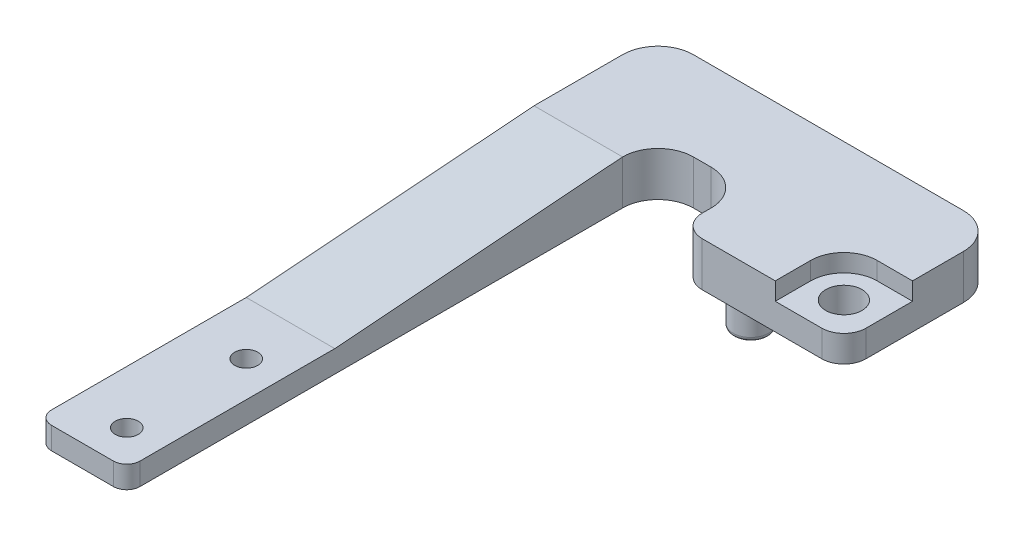
ISO-10303-21;
HEADER;
FILE_DESCRIPTION(('STEP AP214'),'2;1');
FILE_NAME('part.step','',(''),(''),'','','');
FILE_SCHEMA(('AUTOMOTIVE_DESIGN { 1 0 10303 214 1 1 1 1 }'));
ENDSEC;
DATA;
#1=APPLICATION_CONTEXT('core data for automotive mechanical design processes');
#2=APPLICATION_PROTOCOL_DEFINITION('international standard','automotive_design',2000,#1);
#3=PRODUCT_CONTEXT('',#1,'mechanical');
#4=PRODUCT('Part','Part','',(#3));
#5=PRODUCT_RELATED_PRODUCT_CATEGORY('part','',(#4));
#6=PRODUCT_DEFINITION_FORMATION('','',#4);
#7=PRODUCT_DEFINITION_CONTEXT('part definition',#1,'design');
#8=PRODUCT_DEFINITION('design','',#6,#7);
#9=PRODUCT_DEFINITION_SHAPE('','',#8);
#10=(LENGTH_UNIT() NAMED_UNIT(*) SI_UNIT(.MILLI.,.METRE.));
#11=(NAMED_UNIT(*) PLANE_ANGLE_UNIT() SI_UNIT($,.RADIAN.));
#12=(NAMED_UNIT(*) SI_UNIT($,.STERADIAN.) SOLID_ANGLE_UNIT());
#13=UNCERTAINTY_MEASURE_WITH_UNIT(LENGTH_MEASURE(1.E-05),#10,'distance_accuracy_value','');
#14=(GEOMETRIC_REPRESENTATION_CONTEXT(3) GLOBAL_UNCERTAINTY_ASSIGNED_CONTEXT((#13)) GLOBAL_UNIT_ASSIGNED_CONTEXT((#10,
#11,#12)) REPRESENTATION_CONTEXT('',''));
#15=CARTESIAN_POINT('',(0.,0.,0.));
#16=DIRECTION('',(0.,0.,1.));
#17=DIRECTION('',(1.,0.,0.));
#18=AXIS2_PLACEMENT_3D('',#15,#16,#17);
#19=CARTESIAN_POINT('',(28.8534285939556,10.,-14.2067125519253));
#20=DIRECTION('',(0.,-1.,0.));
#21=DIRECTION('',(0.,0.,-1.));
#22=AXIS2_PLACEMENT_3D('',#19,#20,#21);
#23=CYLINDRICAL_SURFACE('',#22,5.);
#24=CARTESIAN_POINT('',(28.8534285939556,6.,-14.2067125519253));
#25=DIRECTION('',(0.,1.,0.));
#26=DIRECTION('',(0.,0.,1.));
#27=AXIS2_PLACEMENT_3D('',#24,#25,#26);
#28=CIRCLE('',#27,4.99999999999999);
#29=CARTESIAN_POINT('',(28.8534285939557,6.,-9.20671255192532));
#30=VERTEX_POINT('',#29);
#31=CARTESIAN_POINT('',(33.8534285939556,6.,-14.2067125519253));
#32=VERTEX_POINT('',#31);
#33=EDGE_CURVE('E69',#30,#32,#28,.T.);
#34=ORIENTED_EDGE('',*,*,#33,.F.);
#35=DIRECTION('',(0.,-1.,0.));
#36=VECTOR('',#35,1.);
#37=CARTESIAN_POINT('',(28.8534285939556,10.,-9.20671255192532));
#38=LINE('',#37,#36);
#39=CARTESIAN_POINT('',(28.8534285939556,0.,-9.20671255192532));
#40=VERTEX_POINT('',#39);
#41=EDGE_CURVE('E401',#30,#40,#38,.T.);
#42=ORIENTED_EDGE('',*,*,#41,.T.);
#43=CARTESIAN_POINT('',(28.8534285939556,0.,-14.2067125519253));
#44=DIRECTION('',(0.,1.,0.));
#45=DIRECTION('',(0.,0.,1.));
#46=AXIS2_PLACEMENT_3D('',#43,#44,#45);
#47=CIRCLE('',#46,5.);
#48=CARTESIAN_POINT('',(33.8534285939556,0.,-14.2067125519253));
#49=VERTEX_POINT('',#48);
#50=EDGE_CURVE('E379',#40,#49,#47,.T.);
#51=ORIENTED_EDGE('',*,*,#50,.T.);
#52=DIRECTION('',(0.,-1.,0.));
#53=VECTOR('',#52,1.);
#54=CARTESIAN_POINT('',(33.8534285939556,10.,-14.2067125519253));
#55=LINE('',#54,#53);
#56=EDGE_CURVE('E398',#32,#49,#55,.T.);
#57=ORIENTED_EDGE('',*,*,#56,.F.);
#58=EDGE_LOOP('',(#34,#42,#51,#57));
#59=FACE_BOUND('',#58,.T.);
#60=ADVANCED_FACE('F45',(#59),#23,.T.);
#61=CARTESIAN_POINT('',(25.8534285939556,10.,-17.2067125519253));
#62=DIRECTION('',(0.,-1.,0.));
#63=DIRECTION('',(0.,0.,-1.));
#64=AXIS2_PLACEMENT_3D('',#61,#62,#63);
#65=CYLINDRICAL_SURFACE('',#64,4.1);
#66=CARTESIAN_POINT('',(25.8534285939556,0.,-17.2067125519253));
#67=DIRECTION('',(0.,1.,0.));
#68=DIRECTION('',(0.,0.,1.));
#69=AXIS2_PLACEMENT_3D('',#66,#67,#68);
#70=CIRCLE('',#69,4.1);
#71=CARTESIAN_POINT('',(25.8534285939556,0.,-13.1067125519253));
#72=VERTEX_POINT('',#71);
#73=EDGE_CURVE('E294',#72,#72,#70,.T.);
#74=ORIENTED_EDGE('',*,*,#73,.F.);
#75=EDGE_LOOP('',(#74));
#76=FACE_BOUND('',#75,.T.);
#77=CARTESIAN_POINT('',(25.8534285939556,6.,-17.2067125519253));
#78=DIRECTION('',(0.,1.,0.));
#79=DIRECTION('',(0.,0.,1.));
#80=AXIS2_PLACEMENT_3D('',#77,#78,#79);
#81=CIRCLE('',#80,4.1);
#82=CARTESIAN_POINT('',(25.8534285939556,6.,-13.1067125519253));
#83=VERTEX_POINT('',#82);
#84=EDGE_CURVE('E276',#83,#83,#81,.T.);
#85=ORIENTED_EDGE('',*,*,#84,.T.);
#86=EDGE_LOOP('',(#85));
#87=FACE_BOUND('',#86,.T.);
#88=ADVANCED_FACE('F479',(#76,#87),#65,.F.);
#89=CARTESIAN_POINT('',(-35.1465714060444,10.,-36.2067125519253));
#90=DIRECTION('',(0.,1.,0.));
#91=DIRECTION('',(0.,0.,1.));
#92=AXIS2_PLACEMENT_3D('',#89,#90,#91);
#93=PLANE('',#92);
#94=DIRECTION('',(1.,0.,0.));
#95=VECTOR('',#94,1.);
#96=CARTESIAN_POINT('',(-159.442506224,10.,-16.2067125519253));
#97=LINE('',#96,#95);
#98=CARTESIAN_POINT('',(-43.1465714060444,10.,-16.2067125519253));
#99=VERTEX_POINT('',#98);
#100=CARTESIAN_POINT('',(-23.1465714060444,10.,-16.2067125519253));
#101=VERTEX_POINT('',#100);
#102=EDGE_CURVE('E212',#99,#101,#97,.T.);
#103=ORIENTED_EDGE('',*,*,#102,.T.);
#104=CARTESIAN_POINT('',(-15.1465714060444,10.,-16.2067125519253));
#105=DIRECTION('',(0.,-1.,0.));
#106=DIRECTION('',(0.,0.,1.));
#107=AXIS2_PLACEMENT_3D('',#104,#105,#106);
#108=CIRCLE('',#107,8.);
#109=CARTESIAN_POINT('',(-15.1465714060444,10.,-24.2067125519253));
#110=VERTEX_POINT('',#109);
#111=EDGE_CURVE('E311',#101,#110,#108,.T.);
#112=ORIENTED_EDGE('',*,*,#111,.T.);
#113=DIRECTION('',(1.,0.,0.));
#114=VECTOR('',#113,1.);
#115=CARTESIAN_POINT('',(-11.1465714060444,10.,-24.2067125519253));
#116=LINE('',#115,#114);
#117=CARTESIAN_POINT('',(-11.1465714060444,10.,-24.2067125519253));
#118=VERTEX_POINT('',#117);
#119=EDGE_CURVE('E314',#110,#118,#116,.T.);
#120=ORIENTED_EDGE('',*,*,#119,.T.);
#121=CARTESIAN_POINT('',(-11.1465714060444,10.,-16.2067125519253));
#122=DIRECTION('',(0.,-1.,0.));
#123=DIRECTION('',(0.,0.,1.));
#124=AXIS2_PLACEMENT_3D('',#121,#122,#123);
#125=CIRCLE('',#124,8.);
#126=CARTESIAN_POINT('',(-3.14657140604436,10.,-16.2067125519253));
#127=VERTEX_POINT('',#126);
#128=EDGE_CURVE('E317',#118,#127,#125,.T.);
#129=ORIENTED_EDGE('',*,*,#128,.T.);
#130=DIRECTION('',(0.,0.,1.));
#131=VECTOR('',#130,1.);
#132=CARTESIAN_POINT('',(-3.14657140604436,10.,-14.2067125519253));
#133=LINE('',#132,#131);
#134=CARTESIAN_POINT('',(-3.14657140604436,10.,-14.2067125519253));
#135=VERTEX_POINT('',#134);
#136=EDGE_CURVE('E320',#127,#135,#133,.T.);
#137=ORIENTED_EDGE('',*,*,#136,.T.);
#138=CARTESIAN_POINT('',(1.85342859395564,10.,-14.2067125519253));
#139=DIRECTION('',(0.,1.,0.));
#140=DIRECTION('',(0.,0.,-1.));
#141=AXIS2_PLACEMENT_3D('',#138,#139,#140);
#142=CIRCLE('',#141,5.);
#143=CARTESIAN_POINT('',(1.85342859395564,10.,-9.20671255192531));
#144=VERTEX_POINT('',#143);
#145=EDGE_CURVE('E323',#135,#144,#142,.T.);
#146=ORIENTED_EDGE('',*,*,#145,.T.);
#147=DIRECTION('',(1.,0.,0.));
#148=VECTOR('',#147,1.);
#149=CARTESIAN_POINT('',(28.8534285939556,10.,-9.20671255192532));
#150=LINE('',#149,#148);
#151=CARTESIAN_POINT('',(18.3534285939556,10.,-9.20671255192532));
#152=VERTEX_POINT('',#151);
#153=EDGE_CURVE('E326',#144,#152,#150,.T.);
#154=ORIENTED_EDGE('',*,*,#153,.T.);
#155=DIRECTION('',(0.,0.,1.));
#156=VECTOR('',#155,1.);
#157=CARTESIAN_POINT('',(18.3534285939556,10.,-17.2067125519253));
#158=LINE('',#157,#156);
#159=CARTESIAN_POINT('',(18.3534285939556,10.,-17.2067125519253));
#160=VERTEX_POINT('',#159);
#161=EDGE_CURVE('E267',#160,#152,#158,.T.);
#162=ORIENTED_EDGE('',*,*,#161,.F.);
#163=CARTESIAN_POINT('',(25.8534285939556,10.,-17.2067125519253));
#164=DIRECTION('',(0.,1.,0.));
#165=DIRECTION('',(0.,0.,1.));
#166=AXIS2_PLACEMENT_3D('',#163,#164,#165);
#167=CIRCLE('',#166,7.5);
#168=CARTESIAN_POINT('',(25.8534285939556,10.,-24.7067125519253));
#169=VERTEX_POINT('',#168);
#170=EDGE_CURVE('E241',#169,#160,#167,.T.);
#171=ORIENTED_EDGE('',*,*,#170,.F.);
#172=DIRECTION('',(-1.,0.,0.));
#173=VECTOR('',#172,1.);
#174=CARTESIAN_POINT('',(25.8534285939556,10.,-24.7067125519253));
#175=LINE('',#174,#173);
#176=CARTESIAN_POINT('',(33.8534285939556,10.,-24.7067125519253));
#177=VERTEX_POINT('',#176);
#178=EDGE_CURVE('E247',#177,#169,#175,.T.);
#179=ORIENTED_EDGE('',*,*,#178,.F.);
#180=DIRECTION('',(0.,0.,-1.));
#181=VECTOR('',#180,1.);
#182=CARTESIAN_POINT('',(33.8534285939556,10.,-14.2067125519253));
#183=LINE('',#182,#181);
#184=CARTESIAN_POINT('',(33.8534285939556,10.,-36.2067125519253));
#185=VERTEX_POINT('',#184);
#186=EDGE_CURVE('E330',#177,#185,#183,.T.);
#187=ORIENTED_EDGE('',*,*,#186,.T.);
#188=CARTESIAN_POINT('',(25.8534285939556,10.,-36.2067125519253));
#189=DIRECTION('',(0.,1.,0.));
#190=DIRECTION('',(0.,0.,1.));
#191=AXIS2_PLACEMENT_3D('',#188,#189,#190);
#192=CIRCLE('',#191,8.);
#193=CARTESIAN_POINT('',(25.8534285939556,10.,-44.2067125519253));
#194=VERTEX_POINT('',#193);
#195=EDGE_CURVE('E333',#185,#194,#192,.T.);
#196=ORIENTED_EDGE('',*,*,#195,.T.);
#197=DIRECTION('',(-1.,0.,0.));
#198=VECTOR('',#197,1.);
#199=CARTESIAN_POINT('',(-3.14657140604435,10.,-44.2067125519253));
#200=LINE('',#199,#198);
#201=CARTESIAN_POINT('',(-35.1465714060444,10.,-44.2067125519253));
#202=VERTEX_POINT('',#201);
#203=EDGE_CURVE('E299',#194,#202,#200,.T.);
#204=ORIENTED_EDGE('',*,*,#203,.T.);
#205=CARTESIAN_POINT('',(-35.1465714060444,10.,-36.2067125519253));
#206=DIRECTION('',(0.,1.,0.));
#207=DIRECTION('',(0.,0.,1.));
#208=AXIS2_PLACEMENT_3D('',#205,#206,#207);
#209=CIRCLE('',#208,8.);
#210=CARTESIAN_POINT('',(-43.1465714060444,10.,-36.2067125519253));
#211=VERTEX_POINT('',#210);
#212=EDGE_CURVE('E303',#202,#211,#209,.T.);
#213=ORIENTED_EDGE('',*,*,#212,.T.);
#214=DIRECTION('',(0.,0.,1.));
#215=VECTOR('',#214,1.);
#216=CARTESIAN_POINT('',(-43.1465714060444,10.,-36.2067125519253));
#217=LINE('',#216,#215);
#218=EDGE_CURVE('E307',#211,#99,#217,.T.);
#219=ORIENTED_EDGE('',*,*,#218,.T.);
#220=EDGE_LOOP('',(#103,#112,#120,#129,#137,#146,#154,#162,#171,#179,#187,#196,#204,#213,#219));
#221=FACE_BOUND('',#220,.T.);
#222=ADVANCED_FACE('F485',(#221),#93,.T.);
#223=CARTESIAN_POINT('',(-35.1465714060444,0.,-36.2067125519253));
#224=DIRECTION('',(0.,1.,0.));
#225=DIRECTION('',(0.,0.,1.));
#226=AXIS2_PLACEMENT_3D('',#223,#224,#225);
#227=PLANE('',#226);
#228=CARTESIAN_POINT('',(4.85342859395564,0.,-17.2067125519253));
#229=DIRECTION('',(0.,1.,0.));
#230=DIRECTION('',(0.,0.,1.));
#231=AXIS2_PLACEMENT_3D('',#228,#229,#230);
#232=CIRCLE('',#231,5.);
#233=CARTESIAN_POINT('',(4.85342859395564,0.,-12.2067125519253));
#234=VERTEX_POINT('',#233);
#235=EDGE_CURVE('E11',#234,#234,#232,.T.);
#236=ORIENTED_EDGE('',*,*,#235,.T.);
#237=EDGE_LOOP('',(#236));
#238=FACE_BOUND('',#237,.T.);
#239=CARTESIAN_POINT('',(-35.1465714060444,0.,-36.2067125519253));
#240=DIRECTION('',(0.,1.,0.));
#241=DIRECTION('',(0.,0.,1.));
#242=AXIS2_PLACEMENT_3D('',#239,#240,#241);
#243=CIRCLE('',#242,8.);
#244=CARTESIAN_POINT('',(-35.1465714060444,0.,-44.2067125519253));
#245=VERTEX_POINT('',#244);
#246=CARTESIAN_POINT('',(-43.1465714060444,0.,-36.2067125519253));
#247=VERTEX_POINT('',#246);
#248=EDGE_CURVE('E298',#245,#247,#243,.T.);
#249=ORIENTED_EDGE('',*,*,#248,.F.);
#250=DIRECTION('',(-1.,0.,0.));
#251=VECTOR('',#250,1.);
#252=CARTESIAN_POINT('',(25.8534285939556,0.,-44.2067125519253));
#253=LINE('',#252,#251);
#254=CARTESIAN_POINT('',(25.8534285939556,0.,-44.2067125519253));
#255=VERTEX_POINT('',#254);
#256=EDGE_CURVE('E304',#255,#245,#253,.T.);
#257=ORIENTED_EDGE('',*,*,#256,.F.);
#258=CARTESIAN_POINT('',(25.8534285939556,0.,-36.2067125519253));
#259=DIRECTION('',(0.,1.,0.));
#260=DIRECTION('',(0.,0.,1.));
#261=AXIS2_PLACEMENT_3D('',#258,#259,#260);
#262=CIRCLE('',#261,8.);
#263=CARTESIAN_POINT('',(33.8534285939556,0.,-36.2067125519253));
#264=VERTEX_POINT('',#263);
#265=EDGE_CURVE('E386',#264,#255,#262,.T.);
#266=ORIENTED_EDGE('',*,*,#265,.F.);
#267=DIRECTION('',(0.,0.,-1.));
#268=VECTOR('',#267,1.);
#269=CARTESIAN_POINT('',(33.8534285939556,0.,-14.2067125519253));
#270=LINE('',#269,#268);
#271=EDGE_CURVE('E383',#49,#264,#270,.T.);
#272=ORIENTED_EDGE('',*,*,#271,.F.);
#273=ORIENTED_EDGE('',*,*,#50,.F.);
#274=DIRECTION('',(1.,0.,0.));
#275=VECTOR('',#274,1.);
#276=CARTESIAN_POINT('',(28.8534285939556,0.,-9.20671255192532));
#277=LINE('',#276,#275);
#278=CARTESIAN_POINT('',(1.85342859395564,0.,-9.20671255192531));
#279=VERTEX_POINT('',#278);
#280=EDGE_CURVE('E375',#279,#40,#277,.T.);
#281=ORIENTED_EDGE('',*,*,#280,.F.);
#282=CARTESIAN_POINT('',(1.85342859395564,0.,-14.2067125519253));
#283=DIRECTION('',(0.,1.,0.));
#284=DIRECTION('',(0.,0.,-1.));
#285=AXIS2_PLACEMENT_3D('',#282,#283,#284);
#286=CIRCLE('',#285,5.);
#287=CARTESIAN_POINT('',(-3.14657140604436,0.,-14.2067125519253));
#288=VERTEX_POINT('',#287);
#289=EDGE_CURVE('E372',#288,#279,#286,.T.);
#290=ORIENTED_EDGE('',*,*,#289,.F.);
#291=DIRECTION('',(0.,0.,1.));
#292=VECTOR('',#291,1.);
#293=CARTESIAN_POINT('',(-3.14657140604436,0.,-14.2067125519253));
#294=LINE('',#293,#292);
#295=CARTESIAN_POINT('',(-3.14657140604436,0.,-16.2067125519253));
#296=VERTEX_POINT('',#295);
#297=EDGE_CURVE('E369',#296,#288,#294,.T.);
#298=ORIENTED_EDGE('',*,*,#297,.F.);
#299=CARTESIAN_POINT('',(-11.1465714060444,0.,-16.2067125519253));
#300=DIRECTION('',(0.,-1.,0.));
#301=DIRECTION('',(0.,0.,1.));
#302=AXIS2_PLACEMENT_3D('',#299,#300,#301);
#303=CIRCLE('',#302,8.);
#304=CARTESIAN_POINT('',(-11.1465714060444,0.,-24.2067125519253));
#305=VERTEX_POINT('',#304);
#306=EDGE_CURVE('E366',#305,#296,#303,.T.);
#307=ORIENTED_EDGE('',*,*,#306,.F.);
#308=DIRECTION('',(1.,0.,0.));
#309=VECTOR('',#308,1.);
#310=CARTESIAN_POINT('',(-11.1465714060444,0.,-24.2067125519253));
#311=LINE('',#310,#309);
#312=CARTESIAN_POINT('',(-15.1465714060444,0.,-24.2067125519253));
#313=VERTEX_POINT('',#312);
#314=EDGE_CURVE('E363',#313,#305,#311,.T.);
#315=ORIENTED_EDGE('',*,*,#314,.F.);
#316=CARTESIAN_POINT('',(-15.1465714060444,0.,-16.2067125519253));
#317=DIRECTION('',(0.,-1.,0.));
#318=DIRECTION('',(0.,0.,1.));
#319=AXIS2_PLACEMENT_3D('',#316,#317,#318);
#320=CIRCLE('',#319,8.);
#321=CARTESIAN_POINT('',(-23.1465714060444,0.,-16.2067125519253));
#322=VERTEX_POINT('',#321);
#323=EDGE_CURVE('E360',#322,#313,#320,.T.);
#324=ORIENTED_EDGE('',*,*,#323,.F.);
#325=DIRECTION('',(0.,0.,-1.));
#326=VECTOR('',#325,1.);
#327=CARTESIAN_POINT('',(-23.1465714060444,0.,-16.2067125519253));
#328=LINE('',#327,#326);
#329=CARTESIAN_POINT('',(-23.1465714060443,0.,92.7932874480747));
#330=VERTEX_POINT('',#329);
#331=EDGE_CURVE('E357',#330,#322,#328,.T.);
#332=ORIENTED_EDGE('',*,*,#331,.F.);
#333=CARTESIAN_POINT('',(-26.1465714060443,0.,92.7932874480747));
#334=DIRECTION('',(0.,1.,0.));
#335=DIRECTION('',(0.,0.,1.));
#336=AXIS2_PLACEMENT_3D('',#333,#334,#335);
#337=CIRCLE('',#336,3.);
#338=CARTESIAN_POINT('',(-26.1465714060444,0.,95.7932874480747));
#339=VERTEX_POINT('',#338);
#340=EDGE_CURVE('E353',#339,#330,#337,.T.);
#341=ORIENTED_EDGE('',*,*,#340,.F.);
#342=DIRECTION('',(1.,0.,0.));
#343=VECTOR('',#342,1.);
#344=CARTESIAN_POINT('',(-40.1465714060443,0.,95.7932874480747));
#345=LINE('',#344,#343);
#346=CARTESIAN_POINT('',(-40.1465714060443,0.,95.7932874480747));
#347=VERTEX_POINT('',#346);
#348=EDGE_CURVE('E349',#347,#339,#345,.T.);
#349=ORIENTED_EDGE('',*,*,#348,.F.);
#350=CARTESIAN_POINT('',(-40.1465714060443,0.,92.7932874480747));
#351=DIRECTION('',(0.,1.,0.));
#352=DIRECTION('',(0.,0.,1.));
#353=AXIS2_PLACEMENT_3D('',#350,#351,#352);
#354=CIRCLE('',#353,3.);
#355=CARTESIAN_POINT('',(-43.1465714060443,0.,92.7932874480747));
#356=VERTEX_POINT('',#355);
#357=EDGE_CURVE('E345',#356,#347,#354,.T.);
#358=ORIENTED_EDGE('',*,*,#357,.F.);
#359=DIRECTION('',(0.,0.,1.));
#360=VECTOR('',#359,1.);
#361=CARTESIAN_POINT('',(-43.1465714060444,0.,-4.2067125519253));
#362=LINE('',#361,#360);
#363=EDGE_CURVE('E341',#247,#356,#362,.T.);
#364=ORIENTED_EDGE('',*,*,#363,.F.);
#365=EDGE_LOOP('',(#249,#257,#266,#272,#273,#281,#290,#298,#307,#315,#324,#332,#341,#349,#358,#364));
#366=FACE_BOUND('',#365,.T.);
#367=ORIENTED_EDGE('',*,*,#73,.T.);
#368=EDGE_LOOP('',(#367));
#369=FACE_BOUND('',#368,.T.);
#370=CARTESIAN_POINT('',(-31.1465714060443,0.,87.7932874480747));
#371=DIRECTION('',(0.,1.,0.));
#372=DIRECTION('',(0.,0.,1.));
#373=AXIS2_PLACEMENT_3D('',#370,#371,#372);
#374=CIRCLE('',#373,2.60000000000001);
#375=CARTESIAN_POINT('',(-31.1465714060443,0.,90.3932874480747));
#376=VERTEX_POINT('',#375);
#377=EDGE_CURVE('E290',#376,#376,#374,.T.);
#378=ORIENTED_EDGE('',*,*,#377,.T.);
#379=EDGE_LOOP('',(#378));
#380=FACE_BOUND('',#379,.T.);
#381=CARTESIAN_POINT('',(-31.1465714060443,0.,60.7932874480747));
#382=DIRECTION('',(0.,1.,0.));
#383=DIRECTION('',(0.,0.,1.));
#384=AXIS2_PLACEMENT_3D('',#381,#382,#383);
#385=CIRCLE('',#384,2.6);
#386=CARTESIAN_POINT('',(-31.1465714060443,0.,63.3932874480747));
#387=VERTEX_POINT('',#386);
#388=EDGE_CURVE('E286',#387,#387,#385,.T.);
#389=ORIENTED_EDGE('',*,*,#388,.T.);
#390=EDGE_LOOP('',(#389));
#391=FACE_BOUND('',#390,.T.);
#392=ADVANCED_FACE('F536',(#238,#366,#369,#380,#391),#227,.F.);
#393=CARTESIAN_POINT('',(-35.1465714060444,10.,-36.2067125519253));
#394=DIRECTION('',(0.,-1.,0.));
#395=DIRECTION('',(0.,0.,-1.));
#396=AXIS2_PLACEMENT_3D('',#393,#394,#395);
#397=CYLINDRICAL_SURFACE('',#396,8.);
#398=ORIENTED_EDGE('',*,*,#248,.T.);
#399=DIRECTION('',(0.,-1.,0.));
#400=VECTOR('',#399,1.);
#401=CARTESIAN_POINT('',(-43.1465714060444,10.,-36.2067125519253));
#402=LINE('',#401,#400);
#403=EDGE_CURVE('E438',#211,#247,#402,.T.);
#404=ORIENTED_EDGE('',*,*,#403,.F.);
#405=ORIENTED_EDGE('',*,*,#212,.F.);
#406=DIRECTION('',(0.,-1.,0.));
#407=VECTOR('',#406,1.);
#408=CARTESIAN_POINT('',(-35.1465714060444,10.,-44.2067125519253));
#409=LINE('',#408,#407);
#410=EDGE_CURVE('E442',#202,#245,#409,.T.);
#411=ORIENTED_EDGE('',*,*,#410,.T.);
#412=EDGE_LOOP('',(#398,#404,#405,#411));
#413=FACE_BOUND('',#412,.T.);
#414=ADVANCED_FACE('F533',(#413),#397,.T.);
#415=CARTESIAN_POINT('',(-43.1465714060444,10.,-4.2067125519253));
#416=DIRECTION('',(1.,0.,0.));
#417=DIRECTION('',(0.,0.,-1.));
#418=AXIS2_PLACEMENT_3D('',#415,#416,#417);
#419=PLANE('',#418);
#420=DIRECTION('',(0.,0.,1.));
#421=VECTOR('',#420,1.);
#422=CARTESIAN_POINT('',(-43.1465714060444,5.,48.7932874480747));
#423=LINE('',#422,#421);
#424=CARTESIAN_POINT('',(-43.1465714060444,5.,48.7932874480747));
#425=VERTEX_POINT('',#424);
#426=CARTESIAN_POINT('',(-43.1465714060444,4.99999999999999,92.7932874480747));
#427=VERTEX_POINT('',#426);
#428=EDGE_CURVE('E224',#425,#427,#423,.T.);
#429=ORIENTED_EDGE('',*,*,#428,.F.);
#430=DIRECTION('',(0.,-0.076696498884737,0.997054485501582));
#431=VECTOR('',#430,1.);
#432=CARTESIAN_POINT('',(-43.1465714060444,10.,-16.2067125519253));
#433=LINE('',#432,#431);
#434=EDGE_CURVE('E210',#99,#425,#433,.T.);
#435=ORIENTED_EDGE('',*,*,#434,.F.);
#436=ORIENTED_EDGE('',*,*,#218,.F.);
#437=ORIENTED_EDGE('',*,*,#403,.T.);
#438=ORIENTED_EDGE('',*,*,#363,.T.);
#439=DIRECTION('',(0.,-1.,0.));
#440=VECTOR('',#439,1.);
#441=CARTESIAN_POINT('',(-43.1465714060443,10.,92.7932874480747));
#442=LINE('',#441,#440);
#443=EDGE_CURVE('E435',#427,#356,#442,.T.);
#444=ORIENTED_EDGE('',*,*,#443,.F.);
#445=EDGE_LOOP('',(#429,#435,#436,#437,#438,#444));
#446=FACE_BOUND('',#445,.T.);
#447=ADVANCED_FACE('F529',(#446),#419,.F.);
#448=CARTESIAN_POINT('',(-40.1465714060443,10.,92.7932874480747));
#449=DIRECTION('',(0.,-1.,0.));
#450=DIRECTION('',(0.,0.,-1.));
#451=AXIS2_PLACEMENT_3D('',#448,#449,#450);
#452=CYLINDRICAL_SURFACE('',#451,3.);
#453=DIRECTION('',(0.,-1.,0.));
#454=VECTOR('',#453,1.);
#455=CARTESIAN_POINT('',(-40.1465714060443,10.,95.7932874480747));
#456=LINE('',#455,#454);
#457=CARTESIAN_POINT('',(-40.1465714060443,4.99999999999999,95.7932874480747));
#458=VERTEX_POINT('',#457);
#459=EDGE_CURVE('E432',#458,#347,#456,.T.);
#460=ORIENTED_EDGE('',*,*,#459,.F.);
#461=CARTESIAN_POINT('',(-40.1465714060443,4.99999999999999,92.7932874480747));
#462=DIRECTION('',(0.,-1.,0.));
#463=DIRECTION('',(0.,0.,-1.));
#464=AXIS2_PLACEMENT_3D('',#461,#462,#463);
#465=CIRCLE('',#464,3.);
#466=EDGE_CURVE('E237',#458,#427,#465,.T.);
#467=ORIENTED_EDGE('',*,*,#466,.T.);
#468=ORIENTED_EDGE('',*,*,#443,.T.);
#469=ORIENTED_EDGE('',*,*,#357,.T.);
#470=EDGE_LOOP('',(#460,#467,#468,#469));
#471=FACE_BOUND('',#470,.T.);
#472=ADVANCED_FACE('F525',(#471),#452,.T.);
#473=CARTESIAN_POINT('',(-40.1465714060443,10.,95.7932874480747));
#474=DIRECTION('',(0.,0.,-1.));
#475=DIRECTION('',(-1.,0.,0.));
#476=AXIS2_PLACEMENT_3D('',#473,#474,#475);
#477=PLANE('',#476);
#478=DIRECTION('',(0.,-1.,0.));
#479=VECTOR('',#478,1.);
#480=CARTESIAN_POINT('',(-26.1465714060444,10.,95.7932874480747));
#481=LINE('',#480,#479);
#482=CARTESIAN_POINT('',(-26.1465714060444,4.99999999999999,95.7932874480747));
#483=VERTEX_POINT('',#482);
#484=EDGE_CURVE('E429',#483,#339,#481,.T.);
#485=ORIENTED_EDGE('',*,*,#484,.F.);
#486=DIRECTION('',(-1.,0.,0.));
#487=VECTOR('',#486,1.);
#488=CARTESIAN_POINT('',(-40.1465714060443,4.99999999999999,95.7932874480747));
#489=LINE('',#488,#487);
#490=EDGE_CURVE('E233',#483,#458,#489,.T.);
#491=ORIENTED_EDGE('',*,*,#490,.T.);
#492=ORIENTED_EDGE('',*,*,#459,.T.);
#493=ORIENTED_EDGE('',*,*,#348,.T.);
#494=EDGE_LOOP('',(#485,#491,#492,#493));
#495=FACE_BOUND('',#494,.T.);
#496=ADVANCED_FACE('F521',(#495),#477,.F.);
#497=CARTESIAN_POINT('',(-26.1465714060443,10.,92.7932874480747));
#498=DIRECTION('',(0.,-1.,0.));
#499=DIRECTION('',(0.,0.,-1.));
#500=AXIS2_PLACEMENT_3D('',#497,#498,#499);
#501=CYLINDRICAL_SURFACE('',#500,3.);
#502=DIRECTION('',(0.,-1.,0.));
#503=VECTOR('',#502,1.);
#504=CARTESIAN_POINT('',(-23.1465714060443,10.,92.7932874480747));
#505=LINE('',#504,#503);
#506=CARTESIAN_POINT('',(-23.1465714060443,5.,92.7932874480747));
#507=VERTEX_POINT('',#506);
#508=EDGE_CURVE('E426',#507,#330,#505,.T.);
#509=ORIENTED_EDGE('',*,*,#508,.F.);
#510=CARTESIAN_POINT('',(-26.1465714060443,4.99999999999999,92.7932874480747));
#511=DIRECTION('',(0.,-1.,0.));
#512=DIRECTION('',(0.,0.,-1.));
#513=AXIS2_PLACEMENT_3D('',#510,#511,#512);
#514=CIRCLE('',#513,3.);
#515=EDGE_CURVE('E61',#507,#483,#514,.T.);
#516=ORIENTED_EDGE('',*,*,#515,.T.);
#517=ORIENTED_EDGE('',*,*,#484,.T.);
#518=ORIENTED_EDGE('',*,*,#340,.T.);
#519=EDGE_LOOP('',(#509,#516,#517,#518));
#520=FACE_BOUND('',#519,.T.);
#521=ADVANCED_FACE('F518',(#520),#501,.T.);
#522=CARTESIAN_POINT('',(-23.1465714060444,10.,-16.2067125519253));
#523=DIRECTION('',(-1.,0.,0.));
#524=DIRECTION('',(0.,0.,1.));
#525=AXIS2_PLACEMENT_3D('',#522,#523,#524);
#526=PLANE('',#525);
#527=DIRECTION('',(0.,-1.,0.));
#528=VECTOR('',#527,1.);
#529=CARTESIAN_POINT('',(-23.1465714060444,10.,-16.2067125519253));
#530=LINE('',#529,#528);
#531=EDGE_CURVE('E217',#101,#322,#530,.T.);
#532=ORIENTED_EDGE('',*,*,#531,.F.);
#533=DIRECTION('',(0.,0.076696498884737,-0.997054485501581));
#534=VECTOR('',#533,1.);
#535=CARTESIAN_POINT('',(-23.1465714060444,10.,-16.2067125519253));
#536=LINE('',#535,#534);
#537=CARTESIAN_POINT('',(-23.1465714060444,5.,48.7932874480747));
#538=VERTEX_POINT('',#537);
#539=EDGE_CURVE('E204',#538,#101,#536,.T.);
#540=ORIENTED_EDGE('',*,*,#539,.F.);
#541=DIRECTION('',(0.,0.,-1.));
#542=VECTOR('',#541,1.);
#543=CARTESIAN_POINT('',(-23.1465714060444,5.,48.7932874480747));
#544=LINE('',#543,#542);
#545=EDGE_CURVE('E195',#507,#538,#544,.T.);
#546=ORIENTED_EDGE('',*,*,#545,.F.);
#547=ORIENTED_EDGE('',*,*,#508,.T.);
#548=ORIENTED_EDGE('',*,*,#331,.T.);
#549=EDGE_LOOP('',(#532,#540,#546,#547,#548));
#550=FACE_BOUND('',#549,.T.);
#551=ADVANCED_FACE('F215',(#550),#526,.F.);
#552=CARTESIAN_POINT('',(-15.1465714060444,10.,-16.2067125519253));
#553=DIRECTION('',(0.,-1.,0.));
#554=DIRECTION('',(0.,0.,-1.));
#555=AXIS2_PLACEMENT_3D('',#552,#553,#554);
#556=CYLINDRICAL_SURFACE('',#555,8.);
#557=ORIENTED_EDGE('',*,*,#323,.T.);
#558=DIRECTION('',(0.,-1.,0.));
#559=VECTOR('',#558,1.);
#560=CARTESIAN_POINT('',(-15.1465714060444,10.,-24.2067125519253));
#561=LINE('',#560,#559);
#562=EDGE_CURVE('E420',#110,#313,#561,.T.);
#563=ORIENTED_EDGE('',*,*,#562,.F.);
#564=ORIENTED_EDGE('',*,*,#111,.F.);
#565=ORIENTED_EDGE('',*,*,#531,.T.);
#566=EDGE_LOOP('',(#557,#563,#564,#565));
#567=FACE_BOUND('',#566,.T.);
#568=ADVANCED_FACE('F511',(#567),#556,.F.);
#569=CARTESIAN_POINT('',(-11.1465714060444,10.,-24.2067125519253));
#570=DIRECTION('',(0.,0.,-1.));
#571=DIRECTION('',(-1.,0.,0.));
#572=AXIS2_PLACEMENT_3D('',#569,#570,#571);
#573=PLANE('',#572);
#574=ORIENTED_EDGE('',*,*,#314,.T.);
#575=DIRECTION('',(0.,-1.,0.));
#576=VECTOR('',#575,1.);
#577=CARTESIAN_POINT('',(-11.1465714060444,10.,-24.2067125519253));
#578=LINE('',#577,#576);
#579=EDGE_CURVE('E416',#118,#305,#578,.T.);
#580=ORIENTED_EDGE('',*,*,#579,.F.);
#581=ORIENTED_EDGE('',*,*,#119,.F.);
#582=ORIENTED_EDGE('',*,*,#562,.T.);
#583=EDGE_LOOP('',(#574,#580,#581,#582));
#584=FACE_BOUND('',#583,.T.);
#585=ADVANCED_FACE('F507',(#584),#573,.F.);
#586=CARTESIAN_POINT('',(-11.1465714060444,10.,-16.2067125519253));
#587=DIRECTION('',(0.,-1.,0.));
#588=DIRECTION('',(0.,0.,-1.));
#589=AXIS2_PLACEMENT_3D('',#586,#587,#588);
#590=CYLINDRICAL_SURFACE('',#589,8.);
#591=ORIENTED_EDGE('',*,*,#306,.T.);
#592=DIRECTION('',(0.,-1.,0.));
#593=VECTOR('',#592,1.);
#594=CARTESIAN_POINT('',(-3.14657140604436,10.,-16.2067125519253));
#595=LINE('',#594,#593);
#596=EDGE_CURVE('E412',#127,#296,#595,.T.);
#597=ORIENTED_EDGE('',*,*,#596,.F.);
#598=ORIENTED_EDGE('',*,*,#128,.F.);
#599=ORIENTED_EDGE('',*,*,#579,.T.);
#600=EDGE_LOOP('',(#591,#597,#598,#599));
#601=FACE_BOUND('',#600,.T.);
#602=ADVANCED_FACE('F503',(#601),#590,.F.);
#603=CARTESIAN_POINT('',(-3.14657140604436,10.,-14.2067125519253));
#604=DIRECTION('',(1.,0.,0.));
#605=DIRECTION('',(0.,0.,-1.));
#606=AXIS2_PLACEMENT_3D('',#603,#604,#605);
#607=PLANE('',#606);
#608=ORIENTED_EDGE('',*,*,#297,.T.);
#609=DIRECTION('',(0.,-1.,0.));
#610=VECTOR('',#609,1.);
#611=CARTESIAN_POINT('',(-3.14657140604436,10.,-14.2067125519253));
#612=LINE('',#611,#610);
#613=EDGE_CURVE('E408',#135,#288,#612,.T.);
#614=ORIENTED_EDGE('',*,*,#613,.F.);
#615=ORIENTED_EDGE('',*,*,#136,.F.);
#616=ORIENTED_EDGE('',*,*,#596,.T.);
#617=EDGE_LOOP('',(#608,#614,#615,#616));
#618=FACE_BOUND('',#617,.T.);
#619=ADVANCED_FACE('F499',(#618),#607,.F.);
#620=CARTESIAN_POINT('',(1.85342859395564,10.,-14.2067125519253));
#621=DIRECTION('',(0.,-1.,0.));
#622=DIRECTION('',(0.,0.,-1.));
#623=AXIS2_PLACEMENT_3D('',#620,#621,#622);
#624=CYLINDRICAL_SURFACE('',#623,5.);
#625=ORIENTED_EDGE('',*,*,#289,.T.);
#626=DIRECTION('',(0.,-1.,0.));
#627=VECTOR('',#626,1.);
#628=CARTESIAN_POINT('',(1.85342859395564,10.,-9.20671255192531));
#629=LINE('',#628,#627);
#630=EDGE_CURVE('E404',#144,#279,#629,.T.);
#631=ORIENTED_EDGE('',*,*,#630,.F.);
#632=ORIENTED_EDGE('',*,*,#145,.F.);
#633=ORIENTED_EDGE('',*,*,#613,.T.);
#634=EDGE_LOOP('',(#625,#631,#632,#633));
#635=FACE_BOUND('',#634,.T.);
#636=ADVANCED_FACE('F495',(#635),#624,.T.);
#637=CARTESIAN_POINT('',(28.8534285939556,10.,-9.20671255192532));
#638=DIRECTION('',(0.,0.,-1.));
#639=DIRECTION('',(-1.,0.,0.));
#640=AXIS2_PLACEMENT_3D('',#637,#638,#639);
#641=PLANE('',#640);
#642=DIRECTION('',(1.,0.,0.));
#643=VECTOR('',#642,1.);
#644=CARTESIAN_POINT('',(18.3534285939556,6.,-9.20671255192532));
#645=LINE('',#644,#643);
#646=CARTESIAN_POINT('',(18.3534285939556,6.,-9.20671255192532));
#647=VERTEX_POINT('',#646);
#648=EDGE_CURVE('E251',#647,#30,#645,.T.);
#649=ORIENTED_EDGE('',*,*,#648,.F.);
#650=DIRECTION('',(0.,1.,0.));
#651=VECTOR('',#650,1.);
#652=CARTESIAN_POINT('',(18.3534285939556,6.,-9.20671255192532));
#653=LINE('',#652,#651);
#654=EDGE_CURVE('E280',#647,#152,#653,.T.);
#655=ORIENTED_EDGE('',*,*,#654,.T.);
#656=ORIENTED_EDGE('',*,*,#153,.F.);
#657=ORIENTED_EDGE('',*,*,#630,.T.);
#658=ORIENTED_EDGE('',*,*,#280,.T.);
#659=ORIENTED_EDGE('',*,*,#41,.F.);
#660=EDGE_LOOP('',(#649,#655,#656,#657,#658,#659));
#661=FACE_BOUND('',#660,.T.);
#662=ADVANCED_FACE('F492',(#661),#641,.F.);
#663=CARTESIAN_POINT('',(33.8534285939556,10.,-14.2067125519253));
#664=DIRECTION('',(-1.,0.,0.));
#665=DIRECTION('',(0.,0.,1.));
#666=AXIS2_PLACEMENT_3D('',#663,#664,#665);
#667=PLANE('',#666);
#668=ORIENTED_EDGE('',*,*,#186,.F.);
#669=DIRECTION('',(0.,1.,0.));
#670=VECTOR('',#669,1.);
#671=CARTESIAN_POINT('',(33.8534285939556,6.,-24.7067125519253));
#672=LINE('',#671,#670);
#673=CARTESIAN_POINT('',(33.8534285939556,6.,-24.7067125519253));
#674=VERTEX_POINT('',#673);
#675=EDGE_CURVE('E277',#674,#177,#672,.T.);
#676=ORIENTED_EDGE('',*,*,#675,.F.);
#677=DIRECTION('',(0.,0.,-1.));
#678=VECTOR('',#677,1.);
#679=CARTESIAN_POINT('',(33.8534285939556,6.,-24.7067125519253));
#680=LINE('',#679,#678);
#681=EDGE_CURVE('E256',#32,#674,#680,.T.);
#682=ORIENTED_EDGE('',*,*,#681,.F.);
#683=ORIENTED_EDGE('',*,*,#56,.T.);
#684=ORIENTED_EDGE('',*,*,#271,.T.);
#685=DIRECTION('',(0.,-1.,0.));
#686=VECTOR('',#685,1.);
#687=CARTESIAN_POINT('',(33.8534285939556,10.,-36.2067125519253));
#688=LINE('',#687,#686);
#689=EDGE_CURVE('E394',#185,#264,#688,.T.);
#690=ORIENTED_EDGE('',*,*,#689,.F.);
#691=EDGE_LOOP('',(#668,#676,#682,#683,#684,#690));
#692=FACE_BOUND('',#691,.T.);
#693=ADVANCED_FACE('F490',(#692),#667,.F.);
#694=CARTESIAN_POINT('',(25.8534285939556,10.,-36.2067125519253));
#695=DIRECTION('',(0.,-1.,0.));
#696=DIRECTION('',(0.,0.,-1.));
#697=AXIS2_PLACEMENT_3D('',#694,#695,#696);
#698=CYLINDRICAL_SURFACE('',#697,8.);
#699=ORIENTED_EDGE('',*,*,#265,.T.);
#700=DIRECTION('',(0.,-1.,0.));
#701=VECTOR('',#700,1.);
#702=CARTESIAN_POINT('',(25.8534285939556,10.,-44.2067125519253));
#703=LINE('',#702,#701);
#704=EDGE_CURVE('E337',#194,#255,#703,.T.);
#705=ORIENTED_EDGE('',*,*,#704,.F.);
#706=ORIENTED_EDGE('',*,*,#195,.F.);
#707=ORIENTED_EDGE('',*,*,#689,.T.);
#708=EDGE_LOOP('',(#699,#705,#706,#707));
#709=FACE_BOUND('',#708,.T.);
#710=ADVANCED_FACE('F561',(#709),#698,.T.);
#711=CARTESIAN_POINT('',(25.8534285939556,10.,-44.2067125519253));
#712=DIRECTION('',(0.,0.,1.));
#713=DIRECTION('',(1.,0.,0.));
#714=AXIS2_PLACEMENT_3D('',#711,#712,#713);
#715=PLANE('',#714);
#716=ORIENTED_EDGE('',*,*,#256,.T.);
#717=ORIENTED_EDGE('',*,*,#410,.F.);
#718=ORIENTED_EDGE('',*,*,#203,.F.);
#719=ORIENTED_EDGE('',*,*,#704,.T.);
#720=EDGE_LOOP('',(#716,#717,#718,#719));
#721=FACE_BOUND('',#720,.T.);
#722=ADVANCED_FACE('F555',(#721),#715,.F.);
#723=CARTESIAN_POINT('',(-31.1465714060443,10.,87.7932874480747));
#724=DIRECTION('',(0.,-1.,0.));
#725=DIRECTION('',(0.,0.,-1.));
#726=AXIS2_PLACEMENT_3D('',#723,#724,#725);
#727=CYLINDRICAL_SURFACE('',#726,2.60000000000001);
#728=CARTESIAN_POINT('',(-31.1465714060443,5.,87.7932874480747));
#729=DIRECTION('',(0.,-1.,0.));
#730=DIRECTION('',(0.,0.,-1.));
#731=AXIS2_PLACEMENT_3D('',#728,#729,#730);
#732=CIRCLE('',#731,2.60000000000001);
#733=CARTESIAN_POINT('',(-31.1465714060443,5.,85.1932874480747));
#734=VERTEX_POINT('',#733);
#735=EDGE_CURVE('E226',#734,#734,#732,.T.);
#736=ORIENTED_EDGE('',*,*,#735,.F.);
#737=EDGE_LOOP('',(#736));
#738=FACE_BOUND('',#737,.T.);
#739=ORIENTED_EDGE('',*,*,#377,.F.);
#740=EDGE_LOOP('',(#739));
#741=FACE_BOUND('',#740,.T.);
#742=ADVANCED_FACE('F620',(#738,#741),#727,.F.);
#743=CARTESIAN_POINT('',(-31.1465714060443,10.,60.7932874480747));
#744=DIRECTION('',(0.,-1.,0.));
#745=DIRECTION('',(0.,0.,-1.));
#746=AXIS2_PLACEMENT_3D('',#743,#744,#745);
#747=CYLINDRICAL_SURFACE('',#746,2.6);
#748=CARTESIAN_POINT('',(-31.1465714060443,5.,60.7932874480747));
#749=DIRECTION('',(0.,-1.,0.));
#750=DIRECTION('',(0.,0.,-1.));
#751=AXIS2_PLACEMENT_3D('',#748,#749,#750);
#752=CIRCLE('',#751,2.6);
#753=CARTESIAN_POINT('',(-31.1465714060443,5.,58.1932874480747));
#754=VERTEX_POINT('',#753);
#755=EDGE_CURVE('E230',#754,#754,#752,.T.);
#756=ORIENTED_EDGE('',*,*,#755,.F.);
#757=EDGE_LOOP('',(#756));
#758=FACE_BOUND('',#757,.T.);
#759=ORIENTED_EDGE('',*,*,#388,.F.);
#760=EDGE_LOOP('',(#759));
#761=FACE_BOUND('',#760,.T.);
#762=ADVANCED_FACE('F613',(#758,#761),#747,.F.);
#763=CARTESIAN_POINT('',(25.8534285939556,6.,-17.2067125519253));
#764=DIRECTION('',(0.,1.,0.));
#765=DIRECTION('',(0.,0.,1.));
#766=AXIS2_PLACEMENT_3D('',#763,#764,#765);
#767=CYLINDRICAL_SURFACE('',#766,7.5);
#768=ORIENTED_EDGE('',*,*,#170,.T.);
#769=DIRECTION('',(0.,1.,0.));
#770=VECTOR('',#769,1.);
#771=CARTESIAN_POINT('',(18.3534285939556,6.,-17.2067125519253));
#772=LINE('',#771,#770);
#773=CARTESIAN_POINT('',(18.3534285939556,6.,-17.2067125519253));
#774=VERTEX_POINT('',#773);
#775=EDGE_CURVE('E263',#774,#160,#772,.T.);
#776=ORIENTED_EDGE('',*,*,#775,.F.);
#777=CARTESIAN_POINT('',(25.8534285939556,6.,-17.2067125519253));
#778=DIRECTION('',(0.,1.,0.));
#779=DIRECTION('',(0.,0.,1.));
#780=AXIS2_PLACEMENT_3D('',#777,#778,#779);
#781=CIRCLE('',#780,7.5);
#782=CARTESIAN_POINT('',(25.8534285939556,6.,-24.7067125519253));
#783=VERTEX_POINT('',#782);
#784=EDGE_CURVE('E242',#783,#774,#781,.T.);
#785=ORIENTED_EDGE('',*,*,#784,.F.);
#786=DIRECTION('',(0.,1.,0.));
#787=VECTOR('',#786,1.);
#788=CARTESIAN_POINT('',(25.8534285939556,6.,-24.7067125519253));
#789=LINE('',#788,#787);
#790=EDGE_CURVE('E273',#783,#169,#789,.T.);
#791=ORIENTED_EDGE('',*,*,#790,.T.);
#792=EDGE_LOOP('',(#768,#776,#785,#791));
#793=FACE_BOUND('',#792,.T.);
#794=ADVANCED_FACE('F603',(#793),#767,.F.);
#795=CARTESIAN_POINT('',(25.8534285939556,6.,-24.7067125519253));
#796=DIRECTION('',(0.,0.,-1.));
#797=DIRECTION('',(-1.,0.,0.));
#798=AXIS2_PLACEMENT_3D('',#795,#796,#797);
#799=PLANE('',#798);
#800=ORIENTED_EDGE('',*,*,#178,.T.);
#801=ORIENTED_EDGE('',*,*,#790,.F.);
#802=DIRECTION('',(-1.,0.,0.));
#803=VECTOR('',#802,1.);
#804=CARTESIAN_POINT('',(25.8534285939556,6.,-24.7067125519253));
#805=LINE('',#804,#803);
#806=EDGE_CURVE('E259',#674,#783,#805,.T.);
#807=ORIENTED_EDGE('',*,*,#806,.F.);
#808=ORIENTED_EDGE('',*,*,#675,.T.);
#809=EDGE_LOOP('',(#800,#801,#807,#808));
#810=FACE_BOUND('',#809,.T.);
#811=ADVANCED_FACE('F605',(#810),#799,.F.);
#812=CARTESIAN_POINT('',(18.3534285939556,6.,-17.2067125519253));
#813=DIRECTION('',(-1.,0.,0.));
#814=DIRECTION('',(0.,0.,1.));
#815=AXIS2_PLACEMENT_3D('',#812,#813,#814);
#816=PLANE('',#815);
#817=ORIENTED_EDGE('',*,*,#161,.T.);
#818=ORIENTED_EDGE('',*,*,#654,.F.);
#819=DIRECTION('',(0.,0.,1.));
#820=VECTOR('',#819,1.);
#821=CARTESIAN_POINT('',(18.3534285939556,6.,-17.2067125519253));
#822=LINE('',#821,#820);
#823=EDGE_CURVE('E246',#774,#647,#822,.T.);
#824=ORIENTED_EDGE('',*,*,#823,.F.);
#825=ORIENTED_EDGE('',*,*,#775,.T.);
#826=EDGE_LOOP('',(#817,#818,#824,#825));
#827=FACE_BOUND('',#826,.T.);
#828=ADVANCED_FACE('F597',(#827),#816,.F.);
#829=CARTESIAN_POINT('',(25.8534285939556,6.,-17.2067125519253));
#830=DIRECTION('',(0.,1.,0.));
#831=DIRECTION('',(0.,0.,1.));
#832=AXIS2_PLACEMENT_3D('',#829,#830,#831);
#833=PLANE('',#832);
#834=ORIENTED_EDGE('',*,*,#84,.F.);
#835=EDGE_LOOP('',(#834));
#836=FACE_BOUND('',#835,.T.);
#837=ORIENTED_EDGE('',*,*,#784,.T.);
#838=ORIENTED_EDGE('',*,*,#823,.T.);
#839=ORIENTED_EDGE('',*,*,#648,.T.);
#840=ORIENTED_EDGE('',*,*,#33,.T.);
#841=ORIENTED_EDGE('',*,*,#681,.T.);
#842=ORIENTED_EDGE('',*,*,#806,.T.);
#843=EDGE_LOOP('',(#837,#838,#839,#840,#841,#842));
#844=FACE_BOUND('',#843,.T.);
#845=ADVANCED_FACE('F599',(#836,#844),#833,.T.);
#846=CARTESIAN_POINT('',(-159.442506224,5.,48.7932874480747));
#847=DIRECTION('',(0.,-1.,0.));
#848=DIRECTION('',(0.,0.,-1.));
#849=AXIS2_PLACEMENT_3D('',#846,#847,#848);
#850=PLANE('',#849);
#851=ORIENTED_EDGE('',*,*,#735,.T.);
#852=EDGE_LOOP('',(#851));
#853=FACE_BOUND('',#852,.T.);
#854=ORIENTED_EDGE('',*,*,#755,.T.);
#855=EDGE_LOOP('',(#854));
#856=FACE_BOUND('',#855,.T.);
#857=ORIENTED_EDGE('',*,*,#490,.F.);
#858=ORIENTED_EDGE('',*,*,#515,.F.);
#859=ORIENTED_EDGE('',*,*,#545,.T.);
#860=DIRECTION('',(1.,0.,0.));
#861=VECTOR('',#860,1.);
#862=CARTESIAN_POINT('',(-159.442506224,5.,48.7932874480747));
#863=LINE('',#862,#861);
#864=EDGE_CURVE('E198',#425,#538,#863,.T.);
#865=ORIENTED_EDGE('',*,*,#864,.F.);
#866=ORIENTED_EDGE('',*,*,#428,.T.);
#867=ORIENTED_EDGE('',*,*,#466,.F.);
#868=EDGE_LOOP('',(#857,#858,#859,#865,#866,#867));
#869=FACE_BOUND('',#868,.T.);
#870=ADVANCED_FACE('F197',(#853,#856,#869),#850,.F.);
#871=CARTESIAN_POINT('',(-159.442506224,10.,-16.2067125519253));
#872=DIRECTION('',(0.,-0.997054485501582,-0.076696498884737));
#873=DIRECTION('',(0.,0.076696498884737,-0.997054485501582));
#874=AXIS2_PLACEMENT_3D('',#871,#872,#873);
#875=PLANE('',#874);
#876=ORIENTED_EDGE('',*,*,#434,.T.);
#877=ORIENTED_EDGE('',*,*,#864,.T.);
#878=ORIENTED_EDGE('',*,*,#539,.T.);
#879=ORIENTED_EDGE('',*,*,#102,.F.);
#880=EDGE_LOOP('',(#876,#877,#878,#879));
#881=FACE_BOUND('',#880,.T.);
#882=ADVANCED_FACE('F207',(#881),#875,.F.);
#883=CARTESIAN_POINT('',(4.85342859395564,21.3137084989848,-17.2067125519253));
#884=DIRECTION('',(0.,-1.,0.));
#885=DIRECTION('',(0.,0.,-1.));
#886=AXIS2_PLACEMENT_3D('',#883,#884,#885);
#887=CYLINDRICAL_SURFACE('',#886,4.);
#888=CARTESIAN_POINT('',(4.85342859395564,-9.,-17.2067125519253));
#889=DIRECTION('',(0.,-1.,0.));
#890=DIRECTION('',(0.,0.,-1.));
#891=AXIS2_PLACEMENT_3D('',#888,#889,#890);
#892=CIRCLE('',#891,4.);
#893=CARTESIAN_POINT('',(4.85342859395564,-9.,-21.2067125519253));
#894=VERTEX_POINT('',#893);
#895=EDGE_CURVE('E54',#894,#894,#892,.F.);
#896=ORIENTED_EDGE('',*,*,#895,.T.);
#897=EDGE_LOOP('',(#896));
#898=FACE_BOUND('',#897,.T.);
#899=CARTESIAN_POINT('',(4.85342859395564,-1.,-17.2067125519253));
#900=DIRECTION('',(0.,1.,0.));
#901=DIRECTION('',(0.,0.,1.));
#902=AXIS2_PLACEMENT_3D('',#899,#900,#901);
#903=CIRCLE('',#902,4.);
#904=CARTESIAN_POINT('',(4.85342859395564,-1.,-13.2067125519253));
#905=VERTEX_POINT('',#904);
#906=EDGE_CURVE('E456',#905,#905,#903,.F.);
#907=ORIENTED_EDGE('',*,*,#906,.T.);
#908=EDGE_LOOP('',(#907));
#909=FACE_BOUND('',#908,.T.);
#910=ADVANCED_FACE('F463',(#898,#909),#887,.T.);
#911=CARTESIAN_POINT('',(4.85342859395564,-10.,-17.2067125519253));
#912=DIRECTION('',(0.,-1.,0.));
#913=DIRECTION('',(0.,0.,-1.));
#914=AXIS2_PLACEMENT_3D('',#911,#912,#913);
#915=PLANE('',#914);
#916=CARTESIAN_POINT('',(4.85342859395564,-10.,-17.2067125519253));
#917=DIRECTION('',(0.,-1.,0.));
#918=DIRECTION('',(0.,0.,-1.));
#919=AXIS2_PLACEMENT_3D('',#916,#917,#918);
#920=CIRCLE('',#919,3.);
#921=CARTESIAN_POINT('',(4.85342859395564,-10.,-20.2067125519253));
#922=VERTEX_POINT('',#921);
#923=EDGE_CURVE('E446',#922,#922,#920,.T.);
#924=ORIENTED_EDGE('',*,*,#923,.T.);
#925=EDGE_LOOP('',(#924));
#926=FACE_BOUND('',#925,.T.);
#927=ADVANCED_FACE('F469',(#926),#915,.T.);
#928=CARTESIAN_POINT('',(4.85342859395564,-9.,-17.2067125519253));
#929=DIRECTION('',(0.,-1.,0.));
#930=DIRECTION('',(0.,0.,-1.));
#931=AXIS2_PLACEMENT_3D('',#928,#929,#930);
#932=TOROIDAL_SURFACE('',#931,3.,1.);
#933=ORIENTED_EDGE('',*,*,#895,.F.);
#934=EDGE_LOOP('',(#933));
#935=FACE_BOUND('',#934,.T.);
#936=ORIENTED_EDGE('',*,*,#923,.F.);
#937=EDGE_LOOP('',(#936));
#938=FACE_BOUND('',#937,.T.);
#939=ADVANCED_FACE('F466',(#935,#938),#932,.T.);
#940=CARTESIAN_POINT('',(4.85342859395564,-1.,-17.2067125519253));
#941=DIRECTION('',(0.,1.,0.));
#942=DIRECTION('',(0.,0.,1.));
#943=AXIS2_PLACEMENT_3D('',#940,#941,#942);
#944=TOROIDAL_SURFACE('',#943,5.,1.);
#945=ORIENTED_EDGE('',*,*,#906,.F.);
#946=EDGE_LOOP('',(#945));
#947=FACE_BOUND('',#946,.T.);
#948=ORIENTED_EDGE('',*,*,#235,.F.);
#949=EDGE_LOOP('',(#948));
#950=FACE_BOUND('',#949,.T.);
#951=ADVANCED_FACE('F47',(#947,#950),#944,.F.);
#952=CLOSED_SHELL('',(#60,#88,#222,#392,#414,#447,#472,#496,#521,#551,#568,#585,#602,#619,#636,
#662,#693,#710,#722,#742,#762,#794,#811,#828,#845,#870,#882,#910,#927,#939,#951));
#953=MANIFOLD_SOLID_BREP('B2',#952);
#954=ADVANCED_BREP_SHAPE_REPRESENTATION('',(#18,#953),#14);
#955=SHAPE_DEFINITION_REPRESENTATION(#9,#954);
ENDSEC;
END-ISO-10303-21;
